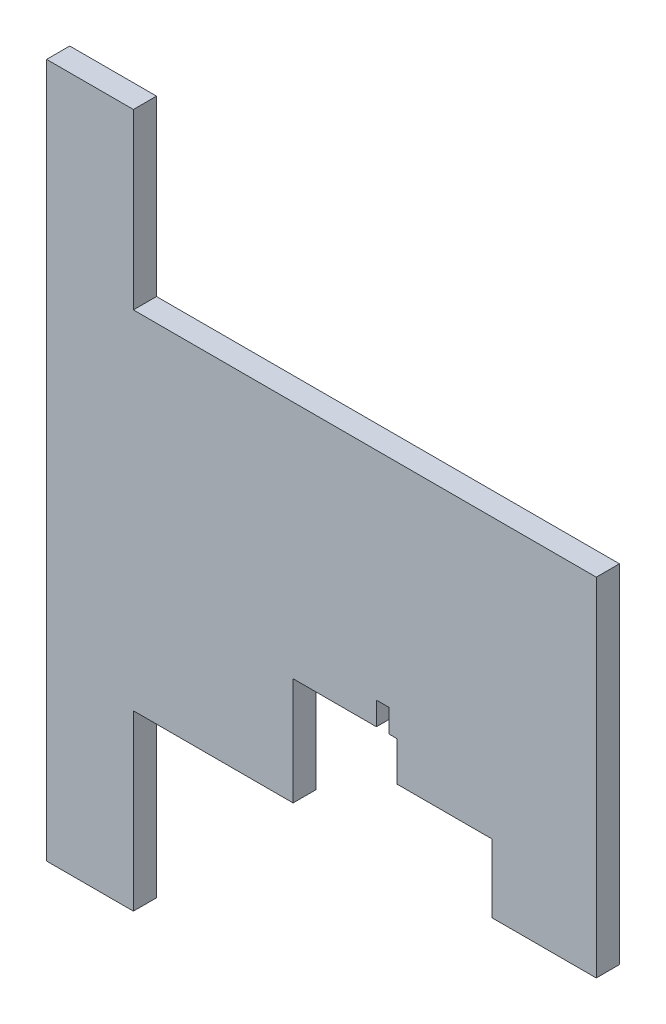
ISO-10303-21;
HEADER;
FILE_DESCRIPTION(('STEP AP214'),'2;1');
FILE_NAME('part.step','',(''),(''),'','','');
FILE_SCHEMA(('AUTOMOTIVE_DESIGN { 1 0 10303 214 1 1 1 1 }'));
ENDSEC;
DATA;
#1=APPLICATION_CONTEXT('core data for automotive mechanical design processes');
#2=APPLICATION_PROTOCOL_DEFINITION('international standard','automotive_design',2000,#1);
#3=PRODUCT_CONTEXT('',#1,'mechanical');
#4=PRODUCT('Part','Part','',(#3));
#5=PRODUCT_RELATED_PRODUCT_CATEGORY('part','',(#4));
#6=PRODUCT_DEFINITION_FORMATION('','',#4);
#7=PRODUCT_DEFINITION_CONTEXT('part definition',#1,'design');
#8=PRODUCT_DEFINITION('design','',#6,#7);
#9=PRODUCT_DEFINITION_SHAPE('','',#8);
#10=(LENGTH_UNIT() NAMED_UNIT(*) SI_UNIT(.MILLI.,.METRE.));
#11=(NAMED_UNIT(*) PLANE_ANGLE_UNIT() SI_UNIT($,.RADIAN.));
#12=(NAMED_UNIT(*) SI_UNIT($,.STERADIAN.) SOLID_ANGLE_UNIT());
#13=UNCERTAINTY_MEASURE_WITH_UNIT(LENGTH_MEASURE(1.E-05),#10,'distance_accuracy_value','');
#14=(GEOMETRIC_REPRESENTATION_CONTEXT(3) GLOBAL_UNCERTAINTY_ASSIGNED_CONTEXT((#13)) GLOBAL_UNIT_ASSIGNED_CONTEXT((#10,
#11,#12)) REPRESENTATION_CONTEXT('',''));
#15=CARTESIAN_POINT('',(0.,0.,0.));
#16=DIRECTION('',(0.,0.,1.));
#17=DIRECTION('',(1.,0.,0.));
#18=AXIS2_PLACEMENT_3D('',#15,#16,#17);
#19=CARTESIAN_POINT('',(101.6,-76.2,5.08));
#20=DIRECTION('',(0.,1.,0.));
#21=DIRECTION('',(-1.,0.,0.));
#22=AXIS2_PLACEMENT_3D('',#19,#20,#21);
#23=PLANE('',#22);
#24=DIRECTION('',(0.,0.,1.));
#25=VECTOR('',#24,1.);
#26=CARTESIAN_POINT('',(35.052,-76.2,0.));
#27=LINE('',#26,#25);
#28=CARTESIAN_POINT('',(35.052,-76.2,0.));
#29=VERTEX_POINT('',#28);
#30=CARTESIAN_POINT('',(35.052,-76.2,5.08));
#31=VERTEX_POINT('',#30);
#32=EDGE_CURVE('E304',#29,#31,#27,.T.);
#33=ORIENTED_EDGE('',*,*,#32,.T.);
#34=DIRECTION('',(1.,0.,0.));
#35=VECTOR('',#34,1.);
#36=CARTESIAN_POINT('',(101.6,-76.2,5.08));
#37=LINE('',#36,#35);
#38=CARTESIAN_POINT('',(0.,-76.2,5.08));
#39=VERTEX_POINT('',#38);
#40=EDGE_CURVE('E139',#39,#31,#37,.T.);
#41=ORIENTED_EDGE('',*,*,#40,.F.);
#42=DIRECTION('',(0.,0.,-1.));
#43=VECTOR('',#42,1.);
#44=CARTESIAN_POINT('',(0.,-76.2,5.08));
#45=LINE('',#44,#43);
#46=CARTESIAN_POINT('',(0.,-76.2,0.));
#47=VERTEX_POINT('',#46);
#48=EDGE_CURVE('E150',#39,#47,#45,.T.);
#49=ORIENTED_EDGE('',*,*,#48,.T.);
#50=DIRECTION('',(1.,0.,0.));
#51=VECTOR('',#50,1.);
#52=CARTESIAN_POINT('',(101.6,-76.2,0.));
#53=LINE('',#52,#51);
#54=EDGE_CURVE('E179',#47,#29,#53,.T.);
#55=ORIENTED_EDGE('',*,*,#54,.T.);
#56=EDGE_LOOP('',(#33,#41,#49,#55));
#57=FACE_BOUND('',#56,.T.);
#58=ADVANCED_FACE('F44',(#57),#23,.F.);
#59=DIRECTION('',(0.,0.,1.));
#60=VECTOR('',#59,1.);
#61=CARTESIAN_POINT('',(78.74,-76.2,0.));
#62=LINE('',#61,#60);
#63=CARTESIAN_POINT('',(78.74,-76.2,0.));
#64=VERTEX_POINT('',#63);
#65=CARTESIAN_POINT('',(78.74,-76.2,5.08));
#66=VERTEX_POINT('',#65);
#67=EDGE_CURVE('E300',#64,#66,#62,.T.);
#68=ORIENTED_EDGE('',*,*,#67,.F.);
#69=CARTESIAN_POINT('',(101.6,-76.2,0.));
#70=VERTEX_POINT('',#69);
#71=EDGE_CURVE('E146',#64,#70,#53,.T.);
#72=ORIENTED_EDGE('',*,*,#71,.T.);
#73=DIRECTION('',(0.,0.,-1.));
#74=VECTOR('',#73,1.);
#75=CARTESIAN_POINT('',(101.6,-76.2,5.08));
#76=LINE('',#75,#74);
#77=CARTESIAN_POINT('',(101.6,-76.2,5.08));
#78=VERTEX_POINT('',#77);
#79=EDGE_CURVE('E143',#78,#70,#76,.T.);
#80=ORIENTED_EDGE('',*,*,#79,.F.);
#81=EDGE_CURVE('E126',#66,#78,#37,.T.);
#82=ORIENTED_EDGE('',*,*,#81,.F.);
#83=EDGE_LOOP('',(#68,#72,#80,#82));
#84=FACE_BOUND('',#83,.T.);
#85=ADVANCED_FACE('F144',(#84),#23,.F.);
#86=CARTESIAN_POINT('',(0.,0.,5.08));
#87=DIRECTION('',(0.,0.,1.));
#88=DIRECTION('',(1.,0.,0.));
#89=AXIS2_PLACEMENT_3D('',#86,#87,#88);
#90=PLANE('',#89);
#91=ORIENTED_EDGE('',*,*,#40,.T.);
#92=DIRECTION('',(0.,1.,0.));
#93=VECTOR('',#92,1.);
#94=CARTESIAN_POINT('',(35.052,0.,5.08));
#95=LINE('',#94,#93);
#96=CARTESIAN_POINT('',(35.052,-52.578,5.08));
#97=VERTEX_POINT('',#96);
#98=EDGE_CURVE('E167',#31,#97,#95,.T.);
#99=ORIENTED_EDGE('',*,*,#98,.T.);
#100=DIRECTION('',(1.,0.,0.));
#101=VECTOR('',#100,1.);
#102=CARTESIAN_POINT('',(0.,-52.578,5.08));
#103=LINE('',#102,#101);
#104=CARTESIAN_POINT('',(53.34,-52.578,5.08));
#105=VERTEX_POINT('',#104);
#106=EDGE_CURVE('E241',#97,#105,#103,.T.);
#107=ORIENTED_EDGE('',*,*,#106,.T.);
#108=DIRECTION('',(0.,1.,0.));
#109=VECTOR('',#108,1.);
#110=CARTESIAN_POINT('',(53.34,0.,5.08));
#111=LINE('',#110,#109);
#112=CARTESIAN_POINT('',(53.34,-47.498,5.08));
#113=VERTEX_POINT('',#112);
#114=EDGE_CURVE('E245',#105,#113,#111,.T.);
#115=ORIENTED_EDGE('',*,*,#114,.T.);
#116=DIRECTION('',(1.,0.,0.));
#117=VECTOR('',#116,1.);
#118=CARTESIAN_POINT('',(0.,-47.498,5.08));
#119=LINE('',#118,#117);
#120=CARTESIAN_POINT('',(56.134,-47.498,5.08));
#121=VERTEX_POINT('',#120);
#122=EDGE_CURVE('E249',#113,#121,#119,.T.);
#123=ORIENTED_EDGE('',*,*,#122,.T.);
#124=DIRECTION('',(0.,-1.,0.));
#125=VECTOR('',#124,1.);
#126=CARTESIAN_POINT('',(56.134,0.,5.08));
#127=LINE('',#126,#125);
#128=CARTESIAN_POINT('',(56.134,-52.578,5.08));
#129=VERTEX_POINT('',#128);
#130=EDGE_CURVE('E253',#121,#129,#127,.T.);
#131=ORIENTED_EDGE('',*,*,#130,.T.);
#132=DIRECTION('',(1.,0.,0.));
#133=VECTOR('',#132,1.);
#134=CARTESIAN_POINT('',(0.,-52.578,5.08));
#135=LINE('',#134,#133);
#136=CARTESIAN_POINT('',(57.912,-52.578,5.08));
#137=VERTEX_POINT('',#136);
#138=EDGE_CURVE('E257',#129,#137,#135,.T.);
#139=ORIENTED_EDGE('',*,*,#138,.T.);
#140=DIRECTION('',(0.,-1.,0.));
#141=VECTOR('',#140,1.);
#142=CARTESIAN_POINT('',(57.912,0.,5.08));
#143=LINE('',#142,#141);
#144=CARTESIAN_POINT('',(57.912,-61.214,5.08));
#145=VERTEX_POINT('',#144);
#146=EDGE_CURVE('E261',#137,#145,#143,.T.);
#147=ORIENTED_EDGE('',*,*,#146,.T.);
#148=DIRECTION('',(1.,0.,0.));
#149=VECTOR('',#148,1.);
#150=CARTESIAN_POINT('',(0.,-61.214,5.08));
#151=LINE('',#150,#149);
#152=CARTESIAN_POINT('',(78.74,-61.214,5.08));
#153=VERTEX_POINT('',#152);
#154=EDGE_CURVE('E265',#145,#153,#151,.T.);
#155=ORIENTED_EDGE('',*,*,#154,.T.);
#156=DIRECTION('',(0.,-1.,0.));
#157=VECTOR('',#156,1.);
#158=CARTESIAN_POINT('',(78.7399999999999,1.45834380353304E-13,5.08));
#159=LINE('',#158,#157);
#160=EDGE_CURVE('E135',#153,#66,#159,.T.);
#161=ORIENTED_EDGE('',*,*,#160,.T.);
#162=ORIENTED_EDGE('',*,*,#81,.T.);
#163=DIRECTION('',(0.,1.,0.));
#164=VECTOR('',#163,1.);
#165=CARTESIAN_POINT('',(101.6,0.,5.08));
#166=LINE('',#165,#164);
#167=CARTESIAN_POINT('',(101.6,0.,5.08));
#168=VERTEX_POINT('',#167);
#169=EDGE_CURVE('E131',#78,#168,#166,.T.);
#170=ORIENTED_EDGE('',*,*,#169,.T.);
#171=DIRECTION('',(-1.,0.,0.));
#172=VECTOR('',#171,1.);
#173=CARTESIAN_POINT('',(0.,0.,5.08));
#174=LINE('',#173,#172);
#175=CARTESIAN_POINT('',(0.,0.,5.08));
#176=VERTEX_POINT('',#175);
#177=EDGE_CURVE('E69',#168,#176,#174,.T.);
#178=ORIENTED_EDGE('',*,*,#177,.T.);
#179=DIRECTION('',(0.,1.,0.));
#180=VECTOR('',#179,1.);
#181=CARTESIAN_POINT('',(0.,0.,5.08));
#182=LINE('',#181,#180);
#183=CARTESIAN_POINT('',(0.,38.1,5.08));
#184=VERTEX_POINT('',#183);
#185=EDGE_CURVE('E188',#176,#184,#182,.T.);
#186=ORIENTED_EDGE('',*,*,#185,.T.);
#187=DIRECTION('',(-1.,0.,0.));
#188=VECTOR('',#187,1.);
#189=CARTESIAN_POINT('',(0.,38.1,5.08));
#190=LINE('',#189,#188);
#191=CARTESIAN_POINT('',(-19.05,38.1,5.08));
#192=VERTEX_POINT('',#191);
#193=EDGE_CURVE('E110',#184,#192,#190,.T.);
#194=ORIENTED_EDGE('',*,*,#193,.T.);
#195=DIRECTION('',(0.,-1.,0.));
#196=VECTOR('',#195,1.);
#197=CARTESIAN_POINT('',(-19.05,38.1,5.08));
#198=LINE('',#197,#196);
#199=CARTESIAN_POINT('',(-19.05,-114.3,5.08));
#200=VERTEX_POINT('',#199);
#201=EDGE_CURVE('E210',#192,#200,#198,.T.);
#202=ORIENTED_EDGE('',*,*,#201,.T.);
#203=DIRECTION('',(1.,0.,0.));
#204=VECTOR('',#203,1.);
#205=CARTESIAN_POINT('',(-19.05,-114.3,5.08));
#206=LINE('',#205,#204);
#207=CARTESIAN_POINT('',(0.,-114.3,5.08));
#208=VERTEX_POINT('',#207);
#209=EDGE_CURVE('E228',#200,#208,#206,.T.);
#210=ORIENTED_EDGE('',*,*,#209,.T.);
#211=DIRECTION('',(0.,1.,0.));
#212=VECTOR('',#211,1.);
#213=CARTESIAN_POINT('',(0.,-114.3,5.08));
#214=LINE('',#213,#212);
#215=EDGE_CURVE('E140',#208,#39,#214,.T.);
#216=ORIENTED_EDGE('',*,*,#215,.T.);
#217=EDGE_LOOP('',(#91,#99,#107,#115,#123,#131,#139,#147,#155,#161,#162,#170,#178,#186,#194,
#202,#210,#216));
#218=FACE_BOUND('',#217,.T.);
#219=ADVANCED_FACE('F129',(#218),#90,.T.);
#220=CARTESIAN_POINT('',(0.,0.,0.));
#221=DIRECTION('',(0.,0.,1.));
#222=DIRECTION('',(1.,0.,0.));
#223=AXIS2_PLACEMENT_3D('',#220,#221,#222);
#224=PLANE('',#223);
#225=DIRECTION('',(0.,1.,0.));
#226=VECTOR('',#225,1.);
#227=CARTESIAN_POINT('',(35.052,-76.2,0.));
#228=LINE('',#227,#226);
#229=CARTESIAN_POINT('',(35.052,-52.578,0.));
#230=VERTEX_POINT('',#229);
#231=EDGE_CURVE('E338',#29,#230,#228,.T.);
#232=ORIENTED_EDGE('',*,*,#231,.F.);
#233=ORIENTED_EDGE('',*,*,#54,.F.);
#234=DIRECTION('',(0.,1.,0.));
#235=VECTOR('',#234,1.);
#236=CARTESIAN_POINT('',(0.,-114.3,0.));
#237=LINE('',#236,#235);
#238=CARTESIAN_POINT('',(0.,-114.3,0.));
#239=VERTEX_POINT('',#238);
#240=EDGE_CURVE('E176',#239,#47,#237,.T.);
#241=ORIENTED_EDGE('',*,*,#240,.F.);
#242=DIRECTION('',(1.,0.,0.));
#243=VECTOR('',#242,1.);
#244=CARTESIAN_POINT('',(-19.05,-114.3,0.));
#245=LINE('',#244,#243);
#246=CARTESIAN_POINT('',(-19.05,-114.3,0.));
#247=VERTEX_POINT('',#246);
#248=EDGE_CURVE('E173',#247,#239,#245,.T.);
#249=ORIENTED_EDGE('',*,*,#248,.F.);
#250=DIRECTION('',(0.,-1.,0.));
#251=VECTOR('',#250,1.);
#252=CARTESIAN_POINT('',(-19.05,38.1,0.));
#253=LINE('',#252,#251);
#254=CARTESIAN_POINT('',(-19.05,38.1,0.));
#255=VERTEX_POINT('',#254);
#256=EDGE_CURVE('E170',#255,#247,#253,.T.);
#257=ORIENTED_EDGE('',*,*,#256,.F.);
#258=DIRECTION('',(-1.,0.,0.));
#259=VECTOR('',#258,1.);
#260=CARTESIAN_POINT('',(0.,38.1,0.));
#261=LINE('',#260,#259);
#262=CARTESIAN_POINT('',(0.,38.1,0.));
#263=VERTEX_POINT('',#262);
#264=EDGE_CURVE('E166',#263,#255,#261,.T.);
#265=ORIENTED_EDGE('',*,*,#264,.F.);
#266=DIRECTION('',(0.,1.,0.));
#267=VECTOR('',#266,1.);
#268=CARTESIAN_POINT('',(0.,0.,0.));
#269=LINE('',#268,#267);
#270=CARTESIAN_POINT('',(0.,0.,0.));
#271=VERTEX_POINT('',#270);
#272=EDGE_CURVE('E162',#271,#263,#269,.T.);
#273=ORIENTED_EDGE('',*,*,#272,.F.);
#274=DIRECTION('',(-1.,0.,0.));
#275=VECTOR('',#274,1.);
#276=CARTESIAN_POINT('',(0.,0.,0.));
#277=LINE('',#276,#275);
#278=CARTESIAN_POINT('',(101.6,0.,0.));
#279=VERTEX_POINT('',#278);
#280=EDGE_CURVE('E102',#279,#271,#277,.T.);
#281=ORIENTED_EDGE('',*,*,#280,.F.);
#282=DIRECTION('',(0.,1.,0.));
#283=VECTOR('',#282,1.);
#284=CARTESIAN_POINT('',(101.6,0.,0.));
#285=LINE('',#284,#283);
#286=EDGE_CURVE('E183',#70,#279,#285,.T.);
#287=ORIENTED_EDGE('',*,*,#286,.F.);
#288=ORIENTED_EDGE('',*,*,#71,.F.);
#289=DIRECTION('',(0.,-1.,0.));
#290=VECTOR('',#289,1.);
#291=CARTESIAN_POINT('',(78.74,-61.214,0.));
#292=LINE('',#291,#290);
#293=CARTESIAN_POINT('',(78.74,-61.214,0.));
#294=VERTEX_POINT('',#293);
#295=EDGE_CURVE('E308',#294,#64,#292,.T.);
#296=ORIENTED_EDGE('',*,*,#295,.F.);
#297=DIRECTION('',(1.,0.,0.));
#298=VECTOR('',#297,1.);
#299=CARTESIAN_POINT('',(57.912,-61.214,0.));
#300=LINE('',#299,#298);
#301=CARTESIAN_POINT('',(57.912,-61.214,0.));
#302=VERTEX_POINT('',#301);
#303=EDGE_CURVE('E311',#302,#294,#300,.T.);
#304=ORIENTED_EDGE('',*,*,#303,.F.);
#305=DIRECTION('',(0.,-1.,0.));
#306=VECTOR('',#305,1.);
#307=CARTESIAN_POINT('',(57.912,-52.578,0.));
#308=LINE('',#307,#306);
#309=CARTESIAN_POINT('',(57.912,-52.578,0.));
#310=VERTEX_POINT('',#309);
#311=EDGE_CURVE('E314',#310,#302,#308,.T.);
#312=ORIENTED_EDGE('',*,*,#311,.F.);
#313=DIRECTION('',(1.,0.,0.));
#314=VECTOR('',#313,1.);
#315=CARTESIAN_POINT('',(56.134,-52.578,0.));
#316=LINE('',#315,#314);
#317=CARTESIAN_POINT('',(56.134,-52.578,0.));
#318=VERTEX_POINT('',#317);
#319=EDGE_CURVE('E318',#318,#310,#316,.T.);
#320=ORIENTED_EDGE('',*,*,#319,.F.);
#321=DIRECTION('',(0.,-1.,0.));
#322=VECTOR('',#321,1.);
#323=CARTESIAN_POINT('',(56.134,-47.498,0.));
#324=LINE('',#323,#322);
#325=CARTESIAN_POINT('',(56.134,-47.498,0.));
#326=VERTEX_POINT('',#325);
#327=EDGE_CURVE('E322',#326,#318,#324,.T.);
#328=ORIENTED_EDGE('',*,*,#327,.F.);
#329=DIRECTION('',(1.,0.,0.));
#330=VECTOR('',#329,1.);
#331=CARTESIAN_POINT('',(53.34,-47.498,0.));
#332=LINE('',#331,#330);
#333=CARTESIAN_POINT('',(53.34,-47.498,0.));
#334=VERTEX_POINT('',#333);
#335=EDGE_CURVE('E326',#334,#326,#332,.T.);
#336=ORIENTED_EDGE('',*,*,#335,.F.);
#337=DIRECTION('',(0.,1.,0.));
#338=VECTOR('',#337,1.);
#339=CARTESIAN_POINT('',(53.34,-52.578,0.));
#340=LINE('',#339,#338);
#341=CARTESIAN_POINT('',(53.34,-52.578,0.));
#342=VERTEX_POINT('',#341);
#343=EDGE_CURVE('E330',#342,#334,#340,.T.);
#344=ORIENTED_EDGE('',*,*,#343,.F.);
#345=DIRECTION('',(1.,0.,0.));
#346=VECTOR('',#345,1.);
#347=CARTESIAN_POINT('',(35.052,-52.578,0.));
#348=LINE('',#347,#346);
#349=EDGE_CURVE('E334',#230,#342,#348,.T.);
#350=ORIENTED_EDGE('',*,*,#349,.F.);
#351=EDGE_LOOP('',(#232,#233,#241,#249,#257,#265,#273,#281,#287,#288,#296,#304,#312,#320,#328,
#336,#344,#350));
#352=FACE_BOUND('',#351,.T.);
#353=ADVANCED_FACE('F214',(#352),#224,.F.);
#354=CARTESIAN_POINT('',(0.,0.,5.08));
#355=DIRECTION('',(-1.,0.,0.));
#356=DIRECTION('',(0.,0.,1.));
#357=AXIS2_PLACEMENT_3D('',#354,#355,#356);
#358=PLANE('',#357);
#359=ORIENTED_EDGE('',*,*,#272,.T.);
#360=DIRECTION('',(0.,0.,-1.));
#361=VECTOR('',#360,1.);
#362=CARTESIAN_POINT('',(0.,38.1,5.08));
#363=LINE('',#362,#361);
#364=EDGE_CURVE('E11',#184,#263,#363,.T.);
#365=ORIENTED_EDGE('',*,*,#364,.F.);
#366=ORIENTED_EDGE('',*,*,#185,.F.);
#367=DIRECTION('',(0.,0.,-1.));
#368=VECTOR('',#367,1.);
#369=CARTESIAN_POINT('',(0.,0.,5.08));
#370=LINE('',#369,#368);
#371=EDGE_CURVE('E158',#176,#271,#370,.T.);
#372=ORIENTED_EDGE('',*,*,#371,.T.);
#373=EDGE_LOOP('',(#359,#365,#366,#372));
#374=FACE_BOUND('',#373,.T.);
#375=ADVANCED_FACE('F46',(#374),#358,.F.);
#376=CARTESIAN_POINT('',(0.,38.1,5.08));
#377=DIRECTION('',(0.,-1.,0.));
#378=DIRECTION('',(0.,0.,-1.));
#379=AXIS2_PLACEMENT_3D('',#376,#377,#378);
#380=PLANE('',#379);
#381=ORIENTED_EDGE('',*,*,#264,.T.);
#382=DIRECTION('',(0.,0.,-1.));
#383=VECTOR('',#382,1.);
#384=CARTESIAN_POINT('',(-19.05,38.1,5.08));
#385=LINE('',#384,#383);
#386=EDGE_CURVE('E53',#192,#255,#385,.T.);
#387=ORIENTED_EDGE('',*,*,#386,.F.);
#388=ORIENTED_EDGE('',*,*,#193,.F.);
#389=ORIENTED_EDGE('',*,*,#364,.T.);
#390=EDGE_LOOP('',(#381,#387,#388,#389));
#391=FACE_BOUND('',#390,.T.);
#392=ADVANCED_FACE('F436',(#391),#380,.F.);
#393=CARTESIAN_POINT('',(-19.05,38.1,5.08));
#394=DIRECTION('',(1.,0.,0.));
#395=DIRECTION('',(0.,1.,0.));
#396=AXIS2_PLACEMENT_3D('',#393,#394,#395);
#397=PLANE('',#396);
#398=ORIENTED_EDGE('',*,*,#256,.T.);
#399=DIRECTION('',(0.,0.,-1.));
#400=VECTOR('',#399,1.);
#401=CARTESIAN_POINT('',(-19.05,-114.3,5.08));
#402=LINE('',#401,#400);
#403=EDGE_CURVE('E200',#200,#247,#402,.T.);
#404=ORIENTED_EDGE('',*,*,#403,.F.);
#405=ORIENTED_EDGE('',*,*,#201,.F.);
#406=ORIENTED_EDGE('',*,*,#386,.T.);
#407=EDGE_LOOP('',(#398,#404,#405,#406));
#408=FACE_BOUND('',#407,.T.);
#409=ADVANCED_FACE('F208',(#408),#397,.F.);
#410=CARTESIAN_POINT('',(-19.05,-114.3,5.08));
#411=DIRECTION('',(0.,1.,0.));
#412=DIRECTION('',(0.,0.,1.));
#413=AXIS2_PLACEMENT_3D('',#410,#411,#412);
#414=PLANE('',#413);
#415=ORIENTED_EDGE('',*,*,#248,.T.);
#416=DIRECTION('',(0.,0.,-1.));
#417=VECTOR('',#416,1.);
#418=CARTESIAN_POINT('',(0.,-114.3,5.08));
#419=LINE('',#418,#417);
#420=EDGE_CURVE('E196',#208,#239,#419,.T.);
#421=ORIENTED_EDGE('',*,*,#420,.F.);
#422=ORIENTED_EDGE('',*,*,#209,.F.);
#423=ORIENTED_EDGE('',*,*,#403,.T.);
#424=EDGE_LOOP('',(#415,#421,#422,#423));
#425=FACE_BOUND('',#424,.T.);
#426=ADVANCED_FACE('F220',(#425),#414,.F.);
#427=CARTESIAN_POINT('',(0.,-114.3,5.08));
#428=DIRECTION('',(-1.,0.,0.));
#429=DIRECTION('',(0.,0.,1.));
#430=AXIS2_PLACEMENT_3D('',#427,#428,#429);
#431=PLANE('',#430);
#432=ORIENTED_EDGE('',*,*,#240,.T.);
#433=ORIENTED_EDGE('',*,*,#48,.F.);
#434=ORIENTED_EDGE('',*,*,#215,.F.);
#435=ORIENTED_EDGE('',*,*,#420,.T.);
#436=EDGE_LOOP('',(#432,#433,#434,#435));
#437=FACE_BOUND('',#436,.T.);
#438=ADVANCED_FACE('F224',(#437),#431,.F.);
#439=CARTESIAN_POINT('',(101.6,0.,5.08));
#440=DIRECTION('',(-1.,0.,0.));
#441=DIRECTION('',(0.,-1.,0.));
#442=AXIS2_PLACEMENT_3D('',#439,#440,#441);
#443=PLANE('',#442);
#444=ORIENTED_EDGE('',*,*,#286,.T.);
#445=DIRECTION('',(0.,0.,-1.));
#446=VECTOR('',#445,1.);
#447=CARTESIAN_POINT('',(101.6,0.,5.08));
#448=LINE('',#447,#446);
#449=EDGE_CURVE('E151',#168,#279,#448,.T.);
#450=ORIENTED_EDGE('',*,*,#449,.F.);
#451=ORIENTED_EDGE('',*,*,#169,.F.);
#452=ORIENTED_EDGE('',*,*,#79,.T.);
#453=EDGE_LOOP('',(#444,#450,#451,#452));
#454=FACE_BOUND('',#453,.T.);
#455=ADVANCED_FACE('F153',(#454),#443,.F.);
#456=CARTESIAN_POINT('',(0.,0.,5.08));
#457=DIRECTION('',(0.,-1.,0.));
#458=DIRECTION('',(0.,0.,-1.));
#459=AXIS2_PLACEMENT_3D('',#456,#457,#458);
#460=PLANE('',#459);
#461=ORIENTED_EDGE('',*,*,#280,.T.);
#462=ORIENTED_EDGE('',*,*,#371,.F.);
#463=ORIENTED_EDGE('',*,*,#177,.F.);
#464=ORIENTED_EDGE('',*,*,#449,.T.);
#465=EDGE_LOOP('',(#461,#462,#463,#464));
#466=FACE_BOUND('',#465,.T.);
#467=ADVANCED_FACE('F444',(#466),#460,.F.);
#468=CARTESIAN_POINT('',(35.052,-76.2,0.));
#469=DIRECTION('',(1.,0.,0.));
#470=DIRECTION('',(0.,1.,0.));
#471=AXIS2_PLACEMENT_3D('',#468,#469,#470);
#472=PLANE('',#471);
#473=ORIENTED_EDGE('',*,*,#32,.F.);
#474=ORIENTED_EDGE('',*,*,#231,.T.);
#475=DIRECTION('',(0.,0.,1.));
#476=VECTOR('',#475,1.);
#477=CARTESIAN_POINT('',(35.052,-52.578,0.));
#478=LINE('',#477,#476);
#479=EDGE_CURVE('E270',#230,#97,#478,.T.);
#480=ORIENTED_EDGE('',*,*,#479,.T.);
#481=ORIENTED_EDGE('',*,*,#98,.F.);
#482=EDGE_LOOP('',(#473,#474,#480,#481));
#483=FACE_BOUND('',#482,.T.);
#484=ADVANCED_FACE('F345',(#483),#472,.T.);
#485=CARTESIAN_POINT('',(35.052,-52.578,0.));
#486=DIRECTION('',(0.,-1.,0.));
#487=DIRECTION('',(0.,0.,-1.));
#488=AXIS2_PLACEMENT_3D('',#485,#486,#487);
#489=PLANE('',#488);
#490=ORIENTED_EDGE('',*,*,#479,.F.);
#491=ORIENTED_EDGE('',*,*,#349,.T.);
#492=DIRECTION('',(0.,0.,1.));
#493=VECTOR('',#492,1.);
#494=CARTESIAN_POINT('',(53.34,-52.578,0.));
#495=LINE('',#494,#493);
#496=EDGE_CURVE('E274',#342,#105,#495,.T.);
#497=ORIENTED_EDGE('',*,*,#496,.T.);
#498=ORIENTED_EDGE('',*,*,#106,.F.);
#499=EDGE_LOOP('',(#490,#491,#497,#498));
#500=FACE_BOUND('',#499,.T.);
#501=ADVANCED_FACE('F353',(#500),#489,.T.);
#502=CARTESIAN_POINT('',(53.34,-52.578,0.));
#503=DIRECTION('',(1.,0.,0.));
#504=DIRECTION('',(0.,0.,-1.));
#505=AXIS2_PLACEMENT_3D('',#502,#503,#504);
#506=PLANE('',#505);
#507=ORIENTED_EDGE('',*,*,#496,.F.);
#508=ORIENTED_EDGE('',*,*,#343,.T.);
#509=DIRECTION('',(0.,0.,1.));
#510=VECTOR('',#509,1.);
#511=CARTESIAN_POINT('',(53.34,-47.498,0.));
#512=LINE('',#511,#510);
#513=EDGE_CURVE('E278',#334,#113,#512,.T.);
#514=ORIENTED_EDGE('',*,*,#513,.T.);
#515=ORIENTED_EDGE('',*,*,#114,.F.);
#516=EDGE_LOOP('',(#507,#508,#514,#515));
#517=FACE_BOUND('',#516,.T.);
#518=ADVANCED_FACE('F362',(#517),#506,.T.);
#519=CARTESIAN_POINT('',(53.34,-47.498,0.));
#520=DIRECTION('',(0.,-1.,0.));
#521=DIRECTION('',(0.,0.,-1.));
#522=AXIS2_PLACEMENT_3D('',#519,#520,#521);
#523=PLANE('',#522);
#524=ORIENTED_EDGE('',*,*,#513,.F.);
#525=ORIENTED_EDGE('',*,*,#335,.T.);
#526=DIRECTION('',(0.,0.,1.));
#527=VECTOR('',#526,1.);
#528=CARTESIAN_POINT('',(56.134,-47.498,0.));
#529=LINE('',#528,#527);
#530=EDGE_CURVE('E282',#326,#121,#529,.T.);
#531=ORIENTED_EDGE('',*,*,#530,.T.);
#532=ORIENTED_EDGE('',*,*,#122,.F.);
#533=EDGE_LOOP('',(#524,#525,#531,#532));
#534=FACE_BOUND('',#533,.T.);
#535=ADVANCED_FACE('F369',(#534),#523,.T.);
#536=CARTESIAN_POINT('',(56.134,-47.498,0.));
#537=DIRECTION('',(-1.,0.,0.));
#538=DIRECTION('',(0.,0.,1.));
#539=AXIS2_PLACEMENT_3D('',#536,#537,#538);
#540=PLANE('',#539);
#541=ORIENTED_EDGE('',*,*,#530,.F.);
#542=ORIENTED_EDGE('',*,*,#327,.T.);
#543=DIRECTION('',(0.,0.,1.));
#544=VECTOR('',#543,1.);
#545=CARTESIAN_POINT('',(56.134,-52.578,0.));
#546=LINE('',#545,#544);
#547=EDGE_CURVE('E286',#318,#129,#546,.T.);
#548=ORIENTED_EDGE('',*,*,#547,.T.);
#549=ORIENTED_EDGE('',*,*,#130,.F.);
#550=EDGE_LOOP('',(#541,#542,#548,#549));
#551=FACE_BOUND('',#550,.T.);
#552=ADVANCED_FACE('F461',(#551),#540,.T.);
#553=CARTESIAN_POINT('',(56.134,-52.578,0.));
#554=DIRECTION('',(0.,-1.,0.));
#555=DIRECTION('',(0.,0.,-1.));
#556=AXIS2_PLACEMENT_3D('',#553,#554,#555);
#557=PLANE('',#556);
#558=ORIENTED_EDGE('',*,*,#547,.F.);
#559=ORIENTED_EDGE('',*,*,#319,.T.);
#560=DIRECTION('',(0.,0.,1.));
#561=VECTOR('',#560,1.);
#562=CARTESIAN_POINT('',(57.912,-52.578,0.));
#563=LINE('',#562,#561);
#564=EDGE_CURVE('E290',#310,#137,#563,.T.);
#565=ORIENTED_EDGE('',*,*,#564,.T.);
#566=ORIENTED_EDGE('',*,*,#138,.F.);
#567=EDGE_LOOP('',(#558,#559,#565,#566));
#568=FACE_BOUND('',#567,.T.);
#569=ADVANCED_FACE('F405',(#568),#557,.T.);
#570=CARTESIAN_POINT('',(57.912,-52.578,0.));
#571=DIRECTION('',(-1.,0.,0.));
#572=DIRECTION('',(0.,0.,1.));
#573=AXIS2_PLACEMENT_3D('',#570,#571,#572);
#574=PLANE('',#573);
#575=ORIENTED_EDGE('',*,*,#564,.F.);
#576=ORIENTED_EDGE('',*,*,#311,.T.);
#577=DIRECTION('',(0.,0.,1.));
#578=VECTOR('',#577,1.);
#579=CARTESIAN_POINT('',(57.912,-61.214,0.));
#580=LINE('',#579,#578);
#581=EDGE_CURVE('E294',#302,#145,#580,.T.);
#582=ORIENTED_EDGE('',*,*,#581,.T.);
#583=ORIENTED_EDGE('',*,*,#146,.F.);
#584=EDGE_LOOP('',(#575,#576,#582,#583));
#585=FACE_BOUND('',#584,.T.);
#586=ADVANCED_FACE('F399',(#585),#574,.T.);
#587=CARTESIAN_POINT('',(57.912,-61.214,0.));
#588=DIRECTION('',(0.,-1.,0.));
#589=DIRECTION('',(0.,0.,-1.));
#590=AXIS2_PLACEMENT_3D('',#587,#588,#589);
#591=PLANE('',#590);
#592=ORIENTED_EDGE('',*,*,#581,.F.);
#593=ORIENTED_EDGE('',*,*,#303,.T.);
#594=DIRECTION('',(0.,0.,1.));
#595=VECTOR('',#594,1.);
#596=CARTESIAN_POINT('',(78.74,-61.214,0.));
#597=LINE('',#596,#595);
#598=EDGE_CURVE('E60',#294,#153,#597,.T.);
#599=ORIENTED_EDGE('',*,*,#598,.T.);
#600=ORIENTED_EDGE('',*,*,#154,.F.);
#601=EDGE_LOOP('',(#592,#593,#599,#600));
#602=FACE_BOUND('',#601,.T.);
#603=ADVANCED_FACE('F413',(#602),#591,.T.);
#604=CARTESIAN_POINT('',(78.74,-61.214,0.));
#605=DIRECTION('',(-1.,0.,0.));
#606=DIRECTION('',(0.,-1.,0.));
#607=AXIS2_PLACEMENT_3D('',#604,#605,#606);
#608=PLANE('',#607);
#609=ORIENTED_EDGE('',*,*,#598,.F.);
#610=ORIENTED_EDGE('',*,*,#295,.T.);
#611=ORIENTED_EDGE('',*,*,#67,.T.);
#612=ORIENTED_EDGE('',*,*,#160,.F.);
#613=EDGE_LOOP('',(#609,#610,#611,#612));
#614=FACE_BOUND('',#613,.T.);
#615=ADVANCED_FACE('F415',(#614),#608,.T.);
#616=CLOSED_SHELL('',(#58,#85,#219,#353,#375,#392,#409,#426,#438,#455,#467,#484,#501,#518,#535,
#552,#569,#586,#603,#615));
#617=MANIFOLD_SOLID_BREP('B2',#616);
#618=ADVANCED_BREP_SHAPE_REPRESENTATION('',(#18,#617),#14);
#619=SHAPE_DEFINITION_REPRESENTATION(#9,#618);
ENDSEC;
END-ISO-10303-21;
